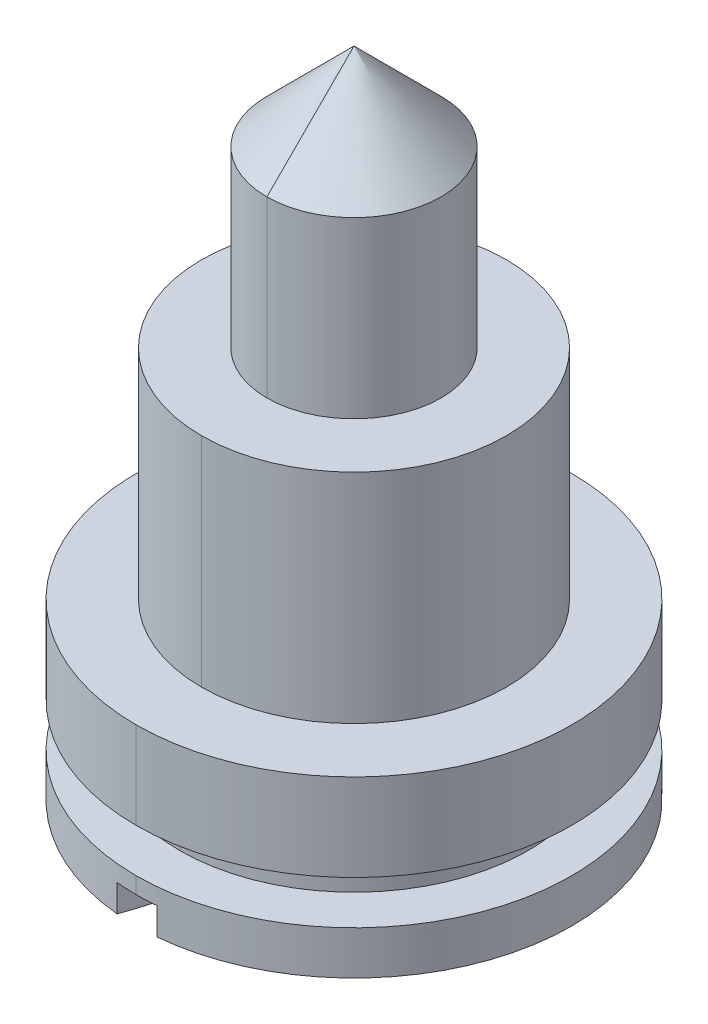
ISO-10303-21;
HEADER;
FILE_DESCRIPTION(('STEP AP214'),'2;1');
FILE_NAME('part.step','',(''),(''),'','','');
FILE_SCHEMA(('AUTOMOTIVE_DESIGN { 1 0 10303 214 1 1 1 1 }'));
ENDSEC;
DATA;
#1=APPLICATION_CONTEXT('core data for automotive mechanical design processes');
#2=APPLICATION_PROTOCOL_DEFINITION('international standard','automotive_design',2000,#1);
#3=PRODUCT_CONTEXT('',#1,'mechanical');
#4=PRODUCT('Part','Part','',(#3));
#5=PRODUCT_RELATED_PRODUCT_CATEGORY('part','',(#4));
#6=PRODUCT_DEFINITION_FORMATION('','',#4);
#7=PRODUCT_DEFINITION_CONTEXT('part definition',#1,'design');
#8=PRODUCT_DEFINITION('design','',#6,#7);
#9=PRODUCT_DEFINITION_SHAPE('','',#8);
#10=(LENGTH_UNIT() NAMED_UNIT(*) SI_UNIT(.MILLI.,.METRE.));
#11=(NAMED_UNIT(*) PLANE_ANGLE_UNIT() SI_UNIT($,.RADIAN.));
#12=(NAMED_UNIT(*) SI_UNIT($,.STERADIAN.) SOLID_ANGLE_UNIT());
#13=UNCERTAINTY_MEASURE_WITH_UNIT(LENGTH_MEASURE(1.E-05),#10,'distance_accuracy_value','');
#14=(GEOMETRIC_REPRESENTATION_CONTEXT(3) GLOBAL_UNCERTAINTY_ASSIGNED_CONTEXT((#13)) GLOBAL_UNIT_ASSIGNED_CONTEXT((#10,
#11,#12)) REPRESENTATION_CONTEXT('',''));
#15=CARTESIAN_POINT('',(0.,0.,0.));
#16=DIRECTION('',(0.,0.,1.));
#17=DIRECTION('',(1.,0.,0.));
#18=AXIS2_PLACEMENT_3D('',#15,#16,#17);
#19=CARTESIAN_POINT('',(1.5,-20.5,0.));
#20=DIRECTION('',(0.,1.,0.));
#21=DIRECTION('',(0.,0.,1.));
#22=AXIS2_PLACEMENT_3D('',#19,#20,#21);
#23=CYLINDRICAL_SURFACE('',#22,3.5);
#24=CARTESIAN_POINT('',(1.5,-31.5,0.));
#25=DIRECTION('',(0.,1.,0.));
#26=DIRECTION('',(0.,0.,1.));
#27=AXIS2_PLACEMENT_3D('',#24,#25,#26);
#28=CIRCLE('',#27,3.5);
#29=CARTESIAN_POINT('',(1.5,-31.5,3.5));
#30=VERTEX_POINT('',#29);
#31=CARTESIAN_POINT('',(1.5,-31.5,-3.5));
#32=VERTEX_POINT('',#31);
#33=EDGE_CURVE('E205',#30,#32,#28,.T.);
#34=ORIENTED_EDGE('',*,*,#33,.T.);
#35=DIRECTION('',(0.,1.,0.));
#36=VECTOR('',#35,1.);
#37=CARTESIAN_POINT('',(1.5,-20.5,-3.5));
#38=LINE('',#37,#36);
#39=CARTESIAN_POINT('',(1.5,-26.5,-3.5));
#40=VERTEX_POINT('',#39);
#41=EDGE_CURVE('E679',#32,#40,#38,.T.);
#42=ORIENTED_EDGE('',*,*,#41,.T.);
#43=CARTESIAN_POINT('',(1.5,-26.5,0.));
#44=DIRECTION('',(0.,1.,0.));
#45=DIRECTION('',(0.,0.,1.));
#46=AXIS2_PLACEMENT_3D('',#43,#44,#45);
#47=CIRCLE('',#46,3.5);
#48=CARTESIAN_POINT('',(1.5,-26.5,3.5));
#49=VERTEX_POINT('',#48);
#50=EDGE_CURVE('E236',#49,#40,#47,.T.);
#51=ORIENTED_EDGE('',*,*,#50,.F.);
#52=DIRECTION('',(0.,1.,0.));
#53=VECTOR('',#52,1.);
#54=CARTESIAN_POINT('',(1.5,-20.5,3.5));
#55=LINE('',#54,#53);
#56=EDGE_CURVE('E707',#30,#49,#55,.T.);
#57=ORIENTED_EDGE('',*,*,#56,.F.);
#58=EDGE_LOOP('',(#34,#42,#51,#57));
#59=FACE_BOUND('',#58,.T.);
#60=ADVANCED_FACE('F16',(#59),#23,.T.);
#61=CARTESIAN_POINT('',(1.5,-20.5,0.));
#62=DIRECTION('',(0.,1.,0.));
#63=DIRECTION('',(0.,0.,1.));
#64=AXIS2_PLACEMENT_3D('',#61,#62,#63);
#65=CYLINDRICAL_SURFACE('',#64,5.);
#66=CARTESIAN_POINT('',(1.5,-33.5,0.));
#67=DIRECTION('',(0.,1.,0.));
#68=DIRECTION('',(0.,0.,1.));
#69=AXIS2_PLACEMENT_3D('',#66,#67,#68);
#70=CIRCLE('',#69,5.);
#71=CARTESIAN_POINT('',(1.5,-33.5,5.));
#72=VERTEX_POINT('',#71);
#73=CARTESIAN_POINT('',(1.5,-33.5,-5.));
#74=VERTEX_POINT('',#73);
#75=EDGE_CURVE('E124',#72,#74,#70,.T.);
#76=ORIENTED_EDGE('',*,*,#75,.T.);
#77=DIRECTION('',(0.,1.,0.));
#78=VECTOR('',#77,1.);
#79=CARTESIAN_POINT('',(1.5,-20.5,-5.));
#80=LINE('',#79,#78);
#81=CARTESIAN_POINT('',(1.5,-31.5,-5.));
#82=VERTEX_POINT('',#81);
#83=EDGE_CURVE('E134',#74,#82,#80,.T.);
#84=ORIENTED_EDGE('',*,*,#83,.T.);
#85=CARTESIAN_POINT('',(1.5,-31.5,0.));
#86=DIRECTION('',(0.,1.,0.));
#87=DIRECTION('',(0.,0.,1.));
#88=AXIS2_PLACEMENT_3D('',#85,#86,#87);
#89=CIRCLE('',#88,5.);
#90=CARTESIAN_POINT('',(1.5,-31.5,5.));
#91=VERTEX_POINT('',#90);
#92=EDGE_CURVE('E709',#91,#82,#89,.T.);
#93=ORIENTED_EDGE('',*,*,#92,.F.);
#94=DIRECTION('',(0.,1.,0.));
#95=VECTOR('',#94,1.);
#96=CARTESIAN_POINT('',(1.5,-20.5,5.));
#97=LINE('',#96,#95);
#98=EDGE_CURVE('E143',#72,#91,#97,.T.);
#99=ORIENTED_EDGE('',*,*,#98,.F.);
#100=EDGE_LOOP('',(#76,#84,#93,#99));
#101=FACE_BOUND('',#100,.T.);
#102=ADVANCED_FACE('F278',(#101),#65,.T.);
#103=CARTESIAN_POINT('',(1.5,-20.5,0.));
#104=DIRECTION('',(0.,1.,0.));
#105=DIRECTION('',(0.,0.,1.));
#106=AXIS2_PLACEMENT_3D('',#103,#104,#105);
#107=CYLINDRICAL_SURFACE('',#106,4.);
#108=CARTESIAN_POINT('',(1.5,-34.5,0.));
#109=DIRECTION('',(0.,1.,0.));
#110=DIRECTION('',(0.,0.,1.));
#111=AXIS2_PLACEMENT_3D('',#108,#109,#110);
#112=CIRCLE('',#111,4.);
#113=CARTESIAN_POINT('',(1.5,-34.5,4.));
#114=VERTEX_POINT('',#113);
#115=CARTESIAN_POINT('',(1.5,-34.5,-4.));
#116=VERTEX_POINT('',#115);
#117=EDGE_CURVE('E217',#114,#116,#112,.T.);
#118=ORIENTED_EDGE('',*,*,#117,.T.);
#119=DIRECTION('',(0.,1.,0.));
#120=VECTOR('',#119,1.);
#121=CARTESIAN_POINT('',(1.5,-20.5,-4.));
#122=LINE('',#121,#120);
#123=CARTESIAN_POINT('',(1.5,-33.5,-4.));
#124=VERTEX_POINT('',#123);
#125=EDGE_CURVE('E659',#116,#124,#122,.T.);
#126=ORIENTED_EDGE('',*,*,#125,.T.);
#127=CARTESIAN_POINT('',(1.5,-33.5,0.));
#128=DIRECTION('',(0.,1.,0.));
#129=DIRECTION('',(0.,0.,1.));
#130=AXIS2_PLACEMENT_3D('',#127,#128,#129);
#131=CIRCLE('',#130,4.);
#132=CARTESIAN_POINT('',(1.5,-33.5,4.));
#133=VERTEX_POINT('',#132);
#134=EDGE_CURVE('E675',#133,#124,#131,.T.);
#135=ORIENTED_EDGE('',*,*,#134,.F.);
#136=DIRECTION('',(0.,1.,0.));
#137=VECTOR('',#136,1.);
#138=CARTESIAN_POINT('',(1.5,-20.5,4.));
#139=LINE('',#138,#137);
#140=EDGE_CURVE('E187',#114,#133,#139,.T.);
#141=ORIENTED_EDGE('',*,*,#140,.F.);
#142=EDGE_LOOP('',(#118,#126,#135,#141));
#143=FACE_BOUND('',#142,.T.);
#144=ADVANCED_FACE('F274',(#143),#107,.T.);
#145=CARTESIAN_POINT('',(1.5,-20.5,0.));
#146=DIRECTION('',(0.,1.,0.));
#147=DIRECTION('',(0.,0.,1.));
#148=AXIS2_PLACEMENT_3D('',#145,#146,#147);
#149=CYLINDRICAL_SURFACE('',#148,5.);
#150=CARTESIAN_POINT('',(1.5,-34.8763460722999,0.));
#151=DIRECTION('',(0.,-1.,0.));
#152=DIRECTION('',(0.,0.,1.));
#153=AXIS2_PLACEMENT_3D('',#150,#151,#152);
#154=CIRCLE('',#153,5.);
#155=CARTESIAN_POINT('',(1.5,-34.8763460722999,-5.));
#156=VERTEX_POINT('',#155);
#157=CARTESIAN_POINT('',(1.95992361185507,-34.8763460722999,-4.97880209199544));
#158=VERTEX_POINT('',#157);
#159=EDGE_CURVE('E192',#156,#158,#154,.T.);
#160=ORIENTED_EDGE('',*,*,#159,.F.);
#161=DIRECTION('',(0.,1.,0.));
#162=VECTOR('',#161,1.);
#163=CARTESIAN_POINT('',(1.5,-20.5,-5.));
#164=LINE('',#163,#162);
#165=CARTESIAN_POINT('',(1.5,-34.5,-5.));
#166=VERTEX_POINT('',#165);
#167=EDGE_CURVE('E223',#156,#166,#164,.T.);
#168=ORIENTED_EDGE('',*,*,#167,.T.);
#169=CARTESIAN_POINT('',(1.5,-34.5,0.));
#170=DIRECTION('',(0.,1.,0.));
#171=DIRECTION('',(0.,0.,1.));
#172=AXIS2_PLACEMENT_3D('',#169,#170,#171);
#173=CIRCLE('',#172,5.);
#174=CARTESIAN_POINT('',(1.5,-34.5,5.));
#175=VERTEX_POINT('',#174);
#176=EDGE_CURVE('E218',#175,#166,#173,.T.);
#177=ORIENTED_EDGE('',*,*,#176,.F.);
#178=DIRECTION('',(0.,1.,0.));
#179=VECTOR('',#178,1.);
#180=CARTESIAN_POINT('',(1.5,-20.5,5.));
#181=LINE('',#180,#179);
#182=CARTESIAN_POINT('',(1.5,-34.8763460722999,5.));
#183=VERTEX_POINT('',#182);
#184=EDGE_CURVE('E177',#183,#175,#181,.T.);
#185=ORIENTED_EDGE('',*,*,#184,.F.);
#186=CARTESIAN_POINT('',(1.5,-34.8763460722999,0.));
#187=DIRECTION('',(0.,-1.,0.));
#188=DIRECTION('',(0.,0.,1.));
#189=AXIS2_PLACEMENT_3D('',#186,#187,#188);
#190=CIRCLE('',#189,5.);
#191=CARTESIAN_POINT('',(1.95992361185507,-34.8763460722999,4.97880209199544));
#192=VERTEX_POINT('',#191);
#193=EDGE_CURVE('E695',#192,#183,#190,.T.);
#194=ORIENTED_EDGE('',*,*,#193,.F.);
#195=DIRECTION('',(0.,1.,0.));
#196=VECTOR('',#195,1.);
#197=CARTESIAN_POINT('',(1.95992361185507,-20.5,4.97880209199544));
#198=LINE('',#197,#196);
#199=CARTESIAN_POINT('',(1.95992361185507,-35.5,4.97880209199544));
#200=VERTEX_POINT('',#199);
#201=EDGE_CURVE('E232',#200,#192,#198,.T.);
#202=ORIENTED_EDGE('',*,*,#201,.F.);
#203=CARTESIAN_POINT('',(1.5,-35.5,0.));
#204=DIRECTION('',(0.,1.,0.));
#205=DIRECTION('',(0.,0.,1.));
#206=AXIS2_PLACEMENT_3D('',#203,#204,#205);
#207=CIRCLE('',#206,5.);
#208=CARTESIAN_POINT('',(1.95992361185507,-35.5,-4.97880209199544));
#209=VERTEX_POINT('',#208);
#210=EDGE_CURVE('E34',#200,#209,#207,.T.);
#211=ORIENTED_EDGE('',*,*,#210,.T.);
#212=DIRECTION('',(0.,-1.,0.));
#213=VECTOR('',#212,1.);
#214=CARTESIAN_POINT('',(1.95992361185507,-20.5,-4.97880209199544));
#215=LINE('',#214,#213);
#216=EDGE_CURVE('E226',#158,#209,#215,.T.);
#217=ORIENTED_EDGE('',*,*,#216,.F.);
#218=EDGE_LOOP('',(#160,#168,#177,#185,#194,#202,#211,#217));
#219=FACE_BOUND('',#218,.T.);
#220=ADVANCED_FACE('F261',(#219),#149,.T.);
#221=CARTESIAN_POINT('',(1.5,-1020.5,0.));
#222=DIRECTION('',(0.,-1.,0.));
#223=DIRECTION('',(0.,0.,-1.));
#224=AXIS2_PLACEMENT_3D('',#221,#222,#223);
#225=CONICAL_SURFACE('',#224,1000.,0.785398163397448);
#226=DIRECTION('',(0.,-0.707106781186548,-0.707106781186547));
#227=VECTOR('',#226,1.);
#228=CARTESIAN_POINT('',(1.5,-20.5,0.));
#229=LINE('',#228,#227);
#230=CARTESIAN_POINT('',(1.5,-20.5,0.));
#231=VERTEX_POINT('',#230);
#232=CARTESIAN_POINT('',(1.5,-22.5,-2.));
#233=VERTEX_POINT('',#232);
#234=EDGE_CURVE('E165',#231,#233,#229,.T.);
#235=ORIENTED_EDGE('',*,*,#234,.F.);
#236=DIRECTION('',(0.,-0.707106781186548,0.707106781186547));
#237=VECTOR('',#236,1.);
#238=CARTESIAN_POINT('',(1.5,-20.5,0.));
#239=LINE('',#238,#237);
#240=CARTESIAN_POINT('',(1.5,-22.5,2.));
#241=VERTEX_POINT('',#240);
#242=EDGE_CURVE('E168',#231,#241,#239,.T.);
#243=ORIENTED_EDGE('',*,*,#242,.T.);
#244=CARTESIAN_POINT('',(1.5,-22.5,0.));
#245=DIRECTION('',(0.,1.,0.));
#246=DIRECTION('',(0.,0.,1.));
#247=AXIS2_PLACEMENT_3D('',#244,#245,#246);
#248=CIRCLE('',#247,2.);
#249=EDGE_CURVE('E10',#241,#233,#248,.T.);
#250=ORIENTED_EDGE('',*,*,#249,.T.);
#251=EDGE_LOOP('',(#235,#243,#250));
#252=FACE_BOUND('',#251,.T.);
#253=ADVANCED_FACE('F167',(#252),#225,.T.);
#254=CARTESIAN_POINT('',(1.5,-20.5,0.));
#255=DIRECTION('',(0.,1.,0.));
#256=DIRECTION('',(0.,0.,1.));
#257=AXIS2_PLACEMENT_3D('',#254,#255,#256);
#258=CYLINDRICAL_SURFACE('',#257,2.);
#259=CARTESIAN_POINT('',(1.5,-26.5,0.));
#260=DIRECTION('',(0.,1.,0.));
#261=DIRECTION('',(0.,0.,1.));
#262=AXIS2_PLACEMENT_3D('',#259,#260,#261);
#263=CIRCLE('',#262,2.);
#264=CARTESIAN_POINT('',(1.5,-26.5,2.));
#265=VERTEX_POINT('',#264);
#266=CARTESIAN_POINT('',(1.5,-26.5,-2.));
#267=VERTEX_POINT('',#266);
#268=EDGE_CURVE('E681',#265,#267,#263,.T.);
#269=ORIENTED_EDGE('',*,*,#268,.T.);
#270=DIRECTION('',(0.,1.,0.));
#271=VECTOR('',#270,1.);
#272=CARTESIAN_POINT('',(1.5,-20.5,-2.));
#273=LINE('',#272,#271);
#274=EDGE_CURVE('E201',#267,#233,#273,.T.);
#275=ORIENTED_EDGE('',*,*,#274,.T.);
#276=ORIENTED_EDGE('',*,*,#249,.F.);
#277=DIRECTION('',(0.,1.,0.));
#278=VECTOR('',#277,1.);
#279=CARTESIAN_POINT('',(1.5,-20.5,2.));
#280=LINE('',#279,#278);
#281=EDGE_CURVE('E197',#265,#241,#280,.T.);
#282=ORIENTED_EDGE('',*,*,#281,.F.);
#283=EDGE_LOOP('',(#269,#275,#276,#282));
#284=FACE_BOUND('',#283,.T.);
#285=ADVANCED_FACE('F255',(#284),#258,.T.);
#286=CARTESIAN_POINT('',(1.5,-16.1629878521575,0.));
#287=DIRECTION('',(0.,1.,0.));
#288=DIRECTION('',(0.,0.,1.));
#289=AXIS2_PLACEMENT_3D('',#286,#287,#288);
#290=DEGENERATE_TOROIDAL_SURFACE('',#289,0.117505026417364,20.0027222272674,.F.);
#291=CARTESIAN_POINT('',(1.95992361185507,-35.5,-4.97880209199544));
#292=CARTESIAN_POINT('',(1.95992361185507,-35.607871474192,-4.5694872907809));
#293=CARTESIAN_POINT('',(1.95992361185507,-35.7027075318624,-4.1568297822873));
#294=CARTESIAN_POINT('',(1.95992361185507,-35.8252147124702,-3.5338037357017));
#295=CARTESIAN_POINT('',(1.95992361185507,-35.862771779768,-3.32536006107941));
#296=CARTESIAN_POINT('',(1.95992361185507,-35.9312399706503,-2.90738576429775));
#297=CARTESIAN_POINT('',(1.95992361185507,-35.9621512595114,-2.69785516930218));
#298=CARTESIAN_POINT('',(1.95992361185507,-36.0168209512656,-2.28151385265223));
#299=CARTESIAN_POINT('',(1.95992361185507,-36.0406927775899,-2.07471799798058));
#300=CARTESIAN_POINT('',(1.95992361185507,-36.0819480733207,-1.66046814570759));
#301=CARTESIAN_POINT('',(1.95992361185507,-36.0993312115523,-1.45301411505854));
#302=CARTESIAN_POINT('',(1.95992361185507,-36.1275520775425,-1.03773404405384));
#303=CARTESIAN_POINT('',(1.95992361185507,-36.1383920179808,-0.829908153319509));
#304=CARTESIAN_POINT('',(1.95992361185507,-36.1533155107741,-0.414019341345143));
#305=CARTESIAN_POINT('',(1.95992361185507,-36.1573997315506,-0.205956445593418));
#306=CARTESIAN_POINT('',(1.95992361185507,-36.1573477734415,0.209995842689134));
#307=CARTESIAN_POINT('',(1.95992361185507,-36.1532184024297,0.417885236148874));
#308=CARTESIAN_POINT('',(1.95992361185507,-36.1382236641129,0.833426396360927));
#309=CARTESIAN_POINT('',(1.95992361185507,-36.1273576315497,1.04107813761543));
#310=CARTESIAN_POINT('',(1.95992361185507,-36.0990943977608,1.45600936642537));
#311=CARTESIAN_POINT('',(1.95992361185507,-36.0816949922348,1.66328870459269));
#312=CARTESIAN_POINT('',(1.95992361185507,-36.0404184721356,2.07718939783407));
#313=CARTESIAN_POINT('',(1.95992361185507,-36.0165416885324,2.28381078598132));
#314=CARTESIAN_POINT('',(1.95992361185507,-35.9618731914972,2.69979790761739));
#315=CARTESIAN_POINT('',(1.95992361185507,-35.9309683364156,2.90914879888033));
#316=CARTESIAN_POINT('',(1.95992361185507,-35.8625243363766,3.32676501798182));
#317=CARTESIAN_POINT('',(1.95992361185507,-35.824985025784,3.53503031858395));
#318=CARTESIAN_POINT('',(1.95992361185507,-35.7025477708943,4.15752493834935));
#319=CARTESIAN_POINT('',(1.95992361185507,-35.6077806280969,4.56983208906184));
#320=CARTESIAN_POINT('',(1.95992361185507,-35.5,4.97880209199544));
#321=B_SPLINE_CURVE_WITH_KNOTS('',3,(#291,#292,#293,#294,#295,#296,#297,#298,#299,#300,#301,
#302,#303,#304,#305,#306,#307,#308,#309,#310,#311,#312,#313,#314,#315,#316,#317,#318,#319,#320),
.UNSPECIFIED.,.F.,.F.,(4,2,2,2,2,2,2,2,2,2,2,2,2,2,4),(0.,1.26945497563068,1.90475641536468,
2.54004205370017,3.16444889694015,3.78888760481709,4.41311503097914,5.03728069140889,
5.66092922480696,6.28463935451267,6.90856010767016,7.5324489868066,8.16719874249865,
8.80196434752607,10.070350654452),.UNSPECIFIED.);
#322=EDGE_CURVE('E230',#209,#200,#321,.T.);
#323=ORIENTED_EDGE('',*,*,#322,.F.);
#324=ORIENTED_EDGE('',*,*,#210,.F.);
#325=EDGE_LOOP('',(#323,#324));
#326=FACE_BOUND('',#325,.T.);
#327=ADVANCED_FACE('F249',(#326),#290,.F.);
#328=CARTESIAN_POINT('',(1.5,-20.5,0.));
#329=DIRECTION('',(0.,1.,0.));
#330=DIRECTION('',(0.,0.,1.));
#331=AXIS2_PLACEMENT_3D('',#328,#329,#330);
#332=CYLINDRICAL_SURFACE('',#331,2.);
#333=ORIENTED_EDGE('',*,*,#274,.F.);
#334=CARTESIAN_POINT('',(1.5,-26.5,0.));
#335=DIRECTION('',(0.,1.,0.));
#336=DIRECTION('',(0.,0.,1.));
#337=AXIS2_PLACEMENT_3D('',#334,#335,#336);
#338=CIRCLE('',#337,2.);
#339=EDGE_CURVE('E685',#267,#265,#338,.T.);
#340=ORIENTED_EDGE('',*,*,#339,.T.);
#341=ORIENTED_EDGE('',*,*,#281,.T.);
#342=CARTESIAN_POINT('',(1.5,-22.5,0.));
#343=DIRECTION('',(0.,1.,0.));
#344=DIRECTION('',(0.,0.,1.));
#345=AXIS2_PLACEMENT_3D('',#342,#343,#344);
#346=CIRCLE('',#345,2.);
#347=EDGE_CURVE('E172',#233,#241,#346,.T.);
#348=ORIENTED_EDGE('',*,*,#347,.F.);
#349=EDGE_LOOP('',(#333,#340,#341,#348));
#350=FACE_BOUND('',#349,.T.);
#351=ADVANCED_FACE('F254',(#350),#332,.T.);
#352=CARTESIAN_POINT('',(1.5,-1020.5,0.));
#353=DIRECTION('',(0.,-1.,0.));
#354=DIRECTION('',(0.,0.,-1.));
#355=AXIS2_PLACEMENT_3D('',#352,#353,#354);
#356=CONICAL_SURFACE('',#355,1000.,0.785398163397448);
#357=ORIENTED_EDGE('',*,*,#242,.F.);
#358=ORIENTED_EDGE('',*,*,#234,.T.);
#359=ORIENTED_EDGE('',*,*,#347,.T.);
#360=EDGE_LOOP('',(#357,#358,#359));
#361=FACE_BOUND('',#360,.T.);
#362=ADVANCED_FACE('F174',(#361),#356,.T.);
#363=CARTESIAN_POINT('',(1.5,-16.1629878521575,0.));
#364=DIRECTION('',(0.,1.,0.));
#365=DIRECTION('',(0.,0.,1.));
#366=AXIS2_PLACEMENT_3D('',#363,#364,#365);
#367=DEGENERATE_TOROIDAL_SURFACE('',#366,0.117505026417364,20.0027222272674,.F.);
#368=CARTESIAN_POINT('',(1.04007638814493,-35.5,4.97880209199544));
#369=CARTESIAN_POINT('',(1.04007638814493,-35.607871474192,4.5694872907809));
#370=CARTESIAN_POINT('',(1.04007638814493,-35.7027075318624,4.1568297822873));
#371=CARTESIAN_POINT('',(1.04007638814493,-35.8252147124702,3.5338037357017));
#372=CARTESIAN_POINT('',(1.04007638814493,-35.862771779768,3.32536006107941));
#373=CARTESIAN_POINT('',(1.04007638814493,-35.9312399706503,2.90738576429775));
#374=CARTESIAN_POINT('',(1.04007638814493,-35.9621512595114,2.69785516930218));
#375=CARTESIAN_POINT('',(1.04007638814493,-36.0168209512656,2.28151385265223));
#376=CARTESIAN_POINT('',(1.04007638814493,-36.0406927775899,2.07471799798058));
#377=CARTESIAN_POINT('',(1.04007638814493,-36.0819480733207,1.66046814570759));
#378=CARTESIAN_POINT('',(1.04007638814493,-36.0993312115523,1.45301411505854));
#379=CARTESIAN_POINT('',(1.04007638814493,-36.1275520775425,1.03773404405384));
#380=CARTESIAN_POINT('',(1.04007638814493,-36.1383920179808,0.829908153319509));
#381=CARTESIAN_POINT('',(1.04007638814493,-36.1533155107741,0.414019341345142));
#382=CARTESIAN_POINT('',(1.04007638814493,-36.1573997315506,0.205956445593417));
#383=CARTESIAN_POINT('',(1.04007638814493,-36.1573477734415,-0.209995842689136));
#384=CARTESIAN_POINT('',(1.04007638814493,-36.1532184024297,-0.417885236148875));
#385=CARTESIAN_POINT('',(1.04007638814493,-36.1382236641129,-0.833426396360928));
#386=CARTESIAN_POINT('',(1.04007638814493,-36.1273576315497,-1.04107813761544));
#387=CARTESIAN_POINT('',(1.04007638814493,-36.0990943977608,-1.45600936642537));
#388=CARTESIAN_POINT('',(1.04007638814493,-36.0816949922348,-1.66328870459269));
#389=CARTESIAN_POINT('',(1.04007638814493,-36.0404184721356,-2.07718939783408));
#390=CARTESIAN_POINT('',(1.04007638814493,-36.0165416885324,-2.28381078598132));
#391=CARTESIAN_POINT('',(1.04007638814493,-35.9618731914972,-2.69979790761739));
#392=CARTESIAN_POINT('',(1.04007638814493,-35.9309683364156,-2.90914879888034));
#393=CARTESIAN_POINT('',(1.04007638814493,-35.8625243363766,-3.32676501798183));
#394=CARTESIAN_POINT('',(1.04007638814493,-35.824985025784,-3.53503031858395));
#395=CARTESIAN_POINT('',(1.04007638814493,-35.7025477708943,-4.15752493834935));
#396=CARTESIAN_POINT('',(1.04007638814493,-35.6077806280969,-4.56983208906184));
#397=CARTESIAN_POINT('',(1.04007638814493,-35.5,-4.97880209199544));
#398=B_SPLINE_CURVE_WITH_KNOTS('',3,(#368,#369,#370,#371,#372,#373,#374,#375,#376,#377,#378,
#379,#380,#381,#382,#383,#384,#385,#386,#387,#388,#389,#390,#391,#392,#393,#394,#395,#396,#397),
.UNSPECIFIED.,.F.,.F.,(4,2,2,2,2,2,2,2,2,2,2,2,2,2,4),(0.,1.26945497563068,1.90475641536468,
2.54004205370017,3.16444889694015,3.78888760481709,4.41311503097914,5.03728069140889,
5.66092922480696,6.28463935451267,6.90856010767016,7.5324489868066,8.16719874249865,
8.80196434752607,10.070350654452),.UNSPECIFIED.);
#399=CARTESIAN_POINT('',(1.04007638814493,-35.5,4.97880209199544));
#400=VERTEX_POINT('',#399);
#401=CARTESIAN_POINT('',(1.04007638814493,-35.5,-4.97880209199544));
#402=VERTEX_POINT('',#401);
#403=EDGE_CURVE('E21',#400,#402,#398,.T.);
#404=ORIENTED_EDGE('',*,*,#403,.F.);
#405=CARTESIAN_POINT('',(1.5,-35.5,0.));
#406=DIRECTION('',(0.,1.,0.));
#407=DIRECTION('',(0.,0.,1.));
#408=AXIS2_PLACEMENT_3D('',#405,#406,#407);
#409=CIRCLE('',#408,5.);
#410=EDGE_CURVE('E86',#402,#400,#409,.T.);
#411=ORIENTED_EDGE('',*,*,#410,.F.);
#412=EDGE_LOOP('',(#404,#411));
#413=FACE_BOUND('',#412,.T.);
#414=ADVANCED_FACE('F297',(#413),#367,.F.);
#415=CARTESIAN_POINT('',(1.5,-20.5,0.));
#416=DIRECTION('',(0.,1.,0.));
#417=DIRECTION('',(0.,0.,1.));
#418=AXIS2_PLACEMENT_3D('',#415,#416,#417);
#419=CYLINDRICAL_SURFACE('',#418,5.);
#420=ORIENTED_EDGE('',*,*,#167,.F.);
#421=CARTESIAN_POINT('',(1.5,-34.8763460722999,0.));
#422=DIRECTION('',(0.,-1.,0.));
#423=DIRECTION('',(0.,0.,1.));
#424=AXIS2_PLACEMENT_3D('',#421,#422,#423);
#425=CIRCLE('',#424,5.);
#426=CARTESIAN_POINT('',(1.04007638814493,-34.8763460722999,-4.97880209199544));
#427=VERTEX_POINT('',#426);
#428=EDGE_CURVE('E189',#427,#156,#425,.T.);
#429=ORIENTED_EDGE('',*,*,#428,.F.);
#430=DIRECTION('',(0.,1.,0.));
#431=VECTOR('',#430,1.);
#432=CARTESIAN_POINT('',(1.04007638814493,-20.5,-4.97880209199544));
#433=LINE('',#432,#431);
#434=EDGE_CURVE('E231',#402,#427,#433,.T.);
#435=ORIENTED_EDGE('',*,*,#434,.F.);
#436=ORIENTED_EDGE('',*,*,#410,.T.);
#437=DIRECTION('',(0.,-1.,0.));
#438=VECTOR('',#437,1.);
#439=CARTESIAN_POINT('',(1.04007638814493,-20.5,4.97880209199544));
#440=LINE('',#439,#438);
#441=CARTESIAN_POINT('',(1.04007638814493,-34.8763460722999,4.97880209199544));
#442=VERTEX_POINT('',#441);
#443=EDGE_CURVE('E97',#442,#400,#440,.T.);
#444=ORIENTED_EDGE('',*,*,#443,.F.);
#445=CARTESIAN_POINT('',(1.5,-34.8763460722999,0.));
#446=DIRECTION('',(0.,-1.,0.));
#447=DIRECTION('',(0.,0.,1.));
#448=AXIS2_PLACEMENT_3D('',#445,#446,#447);
#449=CIRCLE('',#448,5.);
#450=EDGE_CURVE('E196',#183,#442,#449,.T.);
#451=ORIENTED_EDGE('',*,*,#450,.F.);
#452=ORIENTED_EDGE('',*,*,#184,.T.);
#453=CARTESIAN_POINT('',(1.5,-34.5,0.));
#454=DIRECTION('',(0.,1.,0.));
#455=DIRECTION('',(0.,0.,1.));
#456=AXIS2_PLACEMENT_3D('',#453,#454,#455);
#457=CIRCLE('',#456,5.);
#458=EDGE_CURVE('E214',#166,#175,#457,.T.);
#459=ORIENTED_EDGE('',*,*,#458,.F.);
#460=EDGE_LOOP('',(#420,#429,#435,#436,#444,#451,#452,#459));
#461=FACE_BOUND('',#460,.T.);
#462=ADVANCED_FACE('F266',(#461),#419,.T.);
#463=CARTESIAN_POINT('',(0.,-34.5,0.));
#464=DIRECTION('',(0.,1.,0.));
#465=DIRECTION('',(1.,0.,0.));
#466=AXIS2_PLACEMENT_3D('',#463,#464,#465);
#467=PLANE('',#466);
#468=ORIENTED_EDGE('',*,*,#117,.F.);
#469=CARTESIAN_POINT('',(1.5,-34.5,0.));
#470=DIRECTION('',(0.,1.,0.));
#471=DIRECTION('',(0.,0.,1.));
#472=AXIS2_PLACEMENT_3D('',#469,#470,#471);
#473=CIRCLE('',#472,4.);
#474=EDGE_CURVE('E662',#116,#114,#473,.T.);
#475=ORIENTED_EDGE('',*,*,#474,.F.);
#476=EDGE_LOOP('',(#468,#475));
#477=FACE_BOUND('',#476,.T.);
#478=ORIENTED_EDGE('',*,*,#176,.T.);
#479=ORIENTED_EDGE('',*,*,#458,.T.);
#480=EDGE_LOOP('',(#478,#479));
#481=FACE_BOUND('',#480,.T.);
#482=ADVANCED_FACE('F262',(#477,#481),#467,.T.);
#483=CARTESIAN_POINT('',(1.5,-20.5,0.));
#484=DIRECTION('',(0.,1.,0.));
#485=DIRECTION('',(0.,0.,1.));
#486=AXIS2_PLACEMENT_3D('',#483,#484,#485);
#487=CYLINDRICAL_SURFACE('',#486,4.);
#488=ORIENTED_EDGE('',*,*,#125,.F.);
#489=ORIENTED_EDGE('',*,*,#474,.T.);
#490=ORIENTED_EDGE('',*,*,#140,.T.);
#491=CARTESIAN_POINT('',(1.5,-33.5,0.));
#492=DIRECTION('',(0.,1.,0.));
#493=DIRECTION('',(0.,0.,1.));
#494=AXIS2_PLACEMENT_3D('',#491,#492,#493);
#495=CIRCLE('',#494,4.);
#496=EDGE_CURVE('E667',#124,#133,#495,.T.);
#497=ORIENTED_EDGE('',*,*,#496,.F.);
#498=EDGE_LOOP('',(#488,#489,#490,#497));
#499=FACE_BOUND('',#498,.T.);
#500=ADVANCED_FACE('F265',(#499),#487,.T.);
#501=CARTESIAN_POINT('',(0.,-33.5,0.));
#502=DIRECTION('',(0.,-1.,0.));
#503=DIRECTION('',(0.,0.,-1.));
#504=AXIS2_PLACEMENT_3D('',#501,#502,#503);
#505=PLANE('',#504);
#506=ORIENTED_EDGE('',*,*,#134,.T.);
#507=ORIENTED_EDGE('',*,*,#496,.T.);
#508=EDGE_LOOP('',(#506,#507));
#509=FACE_BOUND('',#508,.T.);
#510=ORIENTED_EDGE('',*,*,#75,.F.);
#511=CARTESIAN_POINT('',(1.5,-33.5,0.));
#512=DIRECTION('',(0.,1.,0.));
#513=DIRECTION('',(0.,0.,1.));
#514=AXIS2_PLACEMENT_3D('',#511,#512,#513);
#515=CIRCLE('',#514,5.);
#516=EDGE_CURVE('E204',#74,#72,#515,.T.);
#517=ORIENTED_EDGE('',*,*,#516,.F.);
#518=EDGE_LOOP('',(#510,#517));
#519=FACE_BOUND('',#518,.T.);
#520=ADVANCED_FACE('F270',(#509,#519),#505,.T.);
#521=CARTESIAN_POINT('',(1.5,-20.5,0.));
#522=DIRECTION('',(0.,1.,0.));
#523=DIRECTION('',(0.,0.,1.));
#524=AXIS2_PLACEMENT_3D('',#521,#522,#523);
#525=CYLINDRICAL_SURFACE('',#524,5.);
#526=ORIENTED_EDGE('',*,*,#83,.F.);
#527=ORIENTED_EDGE('',*,*,#516,.T.);
#528=ORIENTED_EDGE('',*,*,#98,.T.);
#529=CARTESIAN_POINT('',(1.5,-31.5,0.));
#530=DIRECTION('',(0.,1.,0.));
#531=DIRECTION('',(0.,0.,1.));
#532=AXIS2_PLACEMENT_3D('',#529,#530,#531);
#533=CIRCLE('',#532,5.);
#534=EDGE_CURVE('E716',#82,#91,#533,.T.);
#535=ORIENTED_EDGE('',*,*,#534,.F.);
#536=EDGE_LOOP('',(#526,#527,#528,#535));
#537=FACE_BOUND('',#536,.T.);
#538=ADVANCED_FACE('F291',(#537),#525,.T.);
#539=CARTESIAN_POINT('',(0.,-31.5,0.));
#540=DIRECTION('',(0.,1.,0.));
#541=DIRECTION('',(1.,0.,0.));
#542=AXIS2_PLACEMENT_3D('',#539,#540,#541);
#543=PLANE('',#542);
#544=ORIENTED_EDGE('',*,*,#33,.F.);
#545=CARTESIAN_POINT('',(1.5,-31.5,0.));
#546=DIRECTION('',(0.,1.,0.));
#547=DIRECTION('',(0.,0.,1.));
#548=AXIS2_PLACEMENT_3D('',#545,#546,#547);
#549=CIRCLE('',#548,3.5);
#550=EDGE_CURVE('E710',#32,#30,#549,.T.);
#551=ORIENTED_EDGE('',*,*,#550,.F.);
#552=EDGE_LOOP('',(#544,#551));
#553=FACE_BOUND('',#552,.T.);
#554=ORIENTED_EDGE('',*,*,#92,.T.);
#555=ORIENTED_EDGE('',*,*,#534,.T.);
#556=EDGE_LOOP('',(#554,#555));
#557=FACE_BOUND('',#556,.T.);
#558=ADVANCED_FACE('F288',(#553,#557),#543,.T.);
#559=CARTESIAN_POINT('',(1.5,-20.5,0.));
#560=DIRECTION('',(0.,1.,0.));
#561=DIRECTION('',(0.,0.,1.));
#562=AXIS2_PLACEMENT_3D('',#559,#560,#561);
#563=CYLINDRICAL_SURFACE('',#562,3.5);
#564=ORIENTED_EDGE('',*,*,#41,.F.);
#565=ORIENTED_EDGE('',*,*,#550,.T.);
#566=ORIENTED_EDGE('',*,*,#56,.T.);
#567=CARTESIAN_POINT('',(1.5,-26.5,0.));
#568=DIRECTION('',(0.,1.,0.));
#569=DIRECTION('',(0.,0.,1.));
#570=AXIS2_PLACEMENT_3D('',#567,#568,#569);
#571=CIRCLE('',#570,3.5);
#572=EDGE_CURVE('E686',#40,#49,#571,.T.);
#573=ORIENTED_EDGE('',*,*,#572,.F.);
#574=EDGE_LOOP('',(#564,#565,#566,#573));
#575=FACE_BOUND('',#574,.T.);
#576=ADVANCED_FACE('F257',(#575),#563,.T.);
#577=CARTESIAN_POINT('',(0.,-26.5,0.));
#578=DIRECTION('',(0.,1.,0.));
#579=DIRECTION('',(1.,0.,0.));
#580=AXIS2_PLACEMENT_3D('',#577,#578,#579);
#581=PLANE('',#580);
#582=ORIENTED_EDGE('',*,*,#268,.F.);
#583=ORIENTED_EDGE('',*,*,#339,.F.);
#584=EDGE_LOOP('',(#582,#583));
#585=FACE_BOUND('',#584,.T.);
#586=ORIENTED_EDGE('',*,*,#50,.T.);
#587=ORIENTED_EDGE('',*,*,#572,.T.);
#588=EDGE_LOOP('',(#586,#587));
#589=FACE_BOUND('',#588,.T.);
#590=ADVANCED_FACE('F383',(#585,#589),#581,.T.);
#591=CARTESIAN_POINT('',(1.95992361185507,-36.536173505821,-15.));
#592=DIRECTION('',(1.,0.,0.));
#593=DIRECTION('',(0.,1.,0.));
#594=AXIS2_PLACEMENT_3D('',#591,#592,#593);
#595=PLANE('',#594);
#596=ORIENTED_EDGE('',*,*,#216,.T.);
#597=ORIENTED_EDGE('',*,*,#322,.T.);
#598=ORIENTED_EDGE('',*,*,#201,.T.);
#599=DIRECTION('',(0.,0.,1.));
#600=VECTOR('',#599,1.);
#601=CARTESIAN_POINT('',(1.95992361185507,-34.8763460722999,-15.));
#602=LINE('',#601,#600);
#603=EDGE_CURVE('E213',#158,#192,#602,.T.);
#604=ORIENTED_EDGE('',*,*,#603,.F.);
#605=EDGE_LOOP('',(#596,#597,#598,#604));
#606=FACE_BOUND('',#605,.T.);
#607=ADVANCED_FACE('F18',(#606),#595,.F.);
#608=CARTESIAN_POINT('',(1.04007638814493,-36.536173505821,-15.));
#609=DIRECTION('',(-1.,0.,0.));
#610=DIRECTION('',(0.,0.,1.));
#611=AXIS2_PLACEMENT_3D('',#608,#609,#610);
#612=PLANE('',#611);
#613=ORIENTED_EDGE('',*,*,#443,.T.);
#614=ORIENTED_EDGE('',*,*,#403,.T.);
#615=ORIENTED_EDGE('',*,*,#434,.T.);
#616=DIRECTION('',(0.,0.,1.));
#617=VECTOR('',#616,1.);
#618=CARTESIAN_POINT('',(1.04007638814493,-34.8763460722999,-15.));
#619=LINE('',#618,#617);
#620=EDGE_CURVE('E193',#427,#442,#619,.T.);
#621=ORIENTED_EDGE('',*,*,#620,.T.);
#622=EDGE_LOOP('',(#613,#614,#615,#621));
#623=FACE_BOUND('',#622,.T.);
#624=ADVANCED_FACE('F286',(#623),#612,.F.);
#625=CARTESIAN_POINT('',(1.04007638814493,-34.8763460722999,-15.));
#626=DIRECTION('',(0.,1.,0.));
#627=DIRECTION('',(1.,0.,0.));
#628=AXIS2_PLACEMENT_3D('',#625,#626,#627);
#629=PLANE('',#628);
#630=ORIENTED_EDGE('',*,*,#428,.T.);
#631=ORIENTED_EDGE('',*,*,#159,.T.);
#632=ORIENTED_EDGE('',*,*,#603,.T.);
#633=ORIENTED_EDGE('',*,*,#193,.T.);
#634=ORIENTED_EDGE('',*,*,#450,.T.);
#635=ORIENTED_EDGE('',*,*,#620,.F.);
#636=EDGE_LOOP('',(#630,#631,#632,#633,#634,#635));
#637=FACE_BOUND('',#636,.T.);
#638=ADVANCED_FACE('F283',(#637),#629,.F.);
#639=CLOSED_SHELL('',(#60,#102,#144,#220,#253,#285,#327,#351,#362,#414,#462,#482,#500,#520,#538,
#558,#576,#590,#607,#624,#638));
#640=MANIFOLD_SOLID_BREP('B1',#639);
#641=ADVANCED_BREP_SHAPE_REPRESENTATION('',(#18,#640),#14);
#642=SHAPE_DEFINITION_REPRESENTATION(#9,#641);
ENDSEC;
END-ISO-10303-21;
